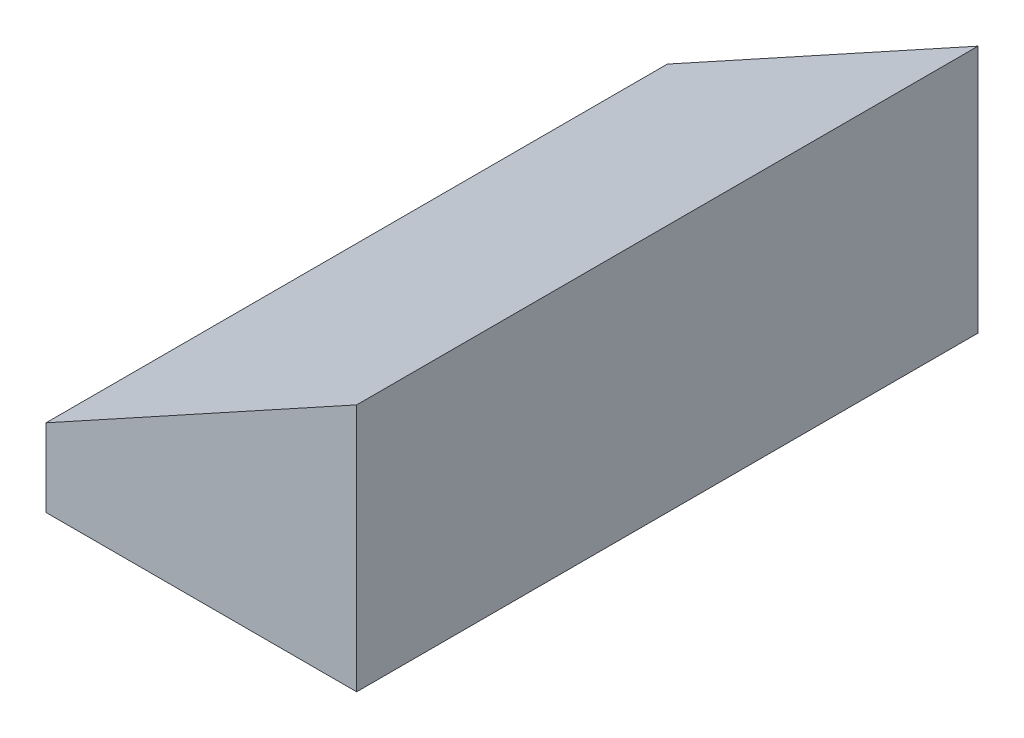
ISO-10303-21;
HEADER;
FILE_DESCRIPTION(('STEP AP214'),'2;1');
FILE_NAME('part.step','',(''),(''),'','','');
FILE_SCHEMA(('AUTOMOTIVE_DESIGN { 1 0 10303 214 1 1 1 1 }'));
ENDSEC;
DATA;
#1=APPLICATION_CONTEXT('core data for automotive mechanical design processes');
#2=APPLICATION_PROTOCOL_DEFINITION('international standard','automotive_design',2000,#1);
#3=PRODUCT_CONTEXT('',#1,'mechanical');
#4=PRODUCT('Part','Part','',(#3));
#5=PRODUCT_RELATED_PRODUCT_CATEGORY('part','',(#4));
#6=PRODUCT_DEFINITION_FORMATION('','',#4);
#7=PRODUCT_DEFINITION_CONTEXT('part definition',#1,'design');
#8=PRODUCT_DEFINITION('design','',#6,#7);
#9=PRODUCT_DEFINITION_SHAPE('','',#8);
#10=(LENGTH_UNIT() NAMED_UNIT(*) SI_UNIT(.MILLI.,.METRE.));
#11=(NAMED_UNIT(*) PLANE_ANGLE_UNIT() SI_UNIT($,.RADIAN.));
#12=(NAMED_UNIT(*) SI_UNIT($,.STERADIAN.) SOLID_ANGLE_UNIT());
#13=UNCERTAINTY_MEASURE_WITH_UNIT(LENGTH_MEASURE(1.E-05),#10,'distance_accuracy_value','');
#14=(GEOMETRIC_REPRESENTATION_CONTEXT(3) GLOBAL_UNCERTAINTY_ASSIGNED_CONTEXT((#13)) GLOBAL_UNIT_ASSIGNED_CONTEXT((#10,
#11,#12)) REPRESENTATION_CONTEXT('',''));
#15=CARTESIAN_POINT('',(0.,0.,0.));
#16=DIRECTION('',(0.,0.,1.));
#17=DIRECTION('',(1.,0.,0.));
#18=AXIS2_PLACEMENT_3D('',#15,#16,#17);
#19=CARTESIAN_POINT('',(8.,0.,16.));
#20=DIRECTION('',(0.,1.,0.));
#21=DIRECTION('',(-1.,0.,0.));
#22=AXIS2_PLACEMENT_3D('',#19,#20,#21);
#23=PLANE('',#22);
#24=DIRECTION('',(1.,0.,0.));
#25=VECTOR('',#24,1.);
#26=CARTESIAN_POINT('',(1.6,0.,1.6));
#27=LINE('',#26,#25);
#28=CARTESIAN_POINT('',(1.6,0.,1.6));
#29=VERTEX_POINT('',#28);
#30=CARTESIAN_POINT('',(6.4,0.,1.6));
#31=VERTEX_POINT('',#30);
#32=EDGE_CURVE('E151',#29,#31,#27,.T.);
#33=ORIENTED_EDGE('',*,*,#32,.F.);
#34=DIRECTION('',(0.,0.,-1.));
#35=VECTOR('',#34,1.);
#36=CARTESIAN_POINT('',(1.6,0.,14.4));
#37=LINE('',#36,#35);
#38=CARTESIAN_POINT('',(1.6,0.,14.4));
#39=VERTEX_POINT('',#38);
#40=EDGE_CURVE('E147',#39,#29,#37,.T.);
#41=ORIENTED_EDGE('',*,*,#40,.F.);
#42=DIRECTION('',(-1.,0.,0.));
#43=VECTOR('',#42,1.);
#44=CARTESIAN_POINT('',(1.6,0.,14.4));
#45=LINE('',#44,#43);
#46=CARTESIAN_POINT('',(6.4,0.,14.4));
#47=VERTEX_POINT('',#46);
#48=EDGE_CURVE('E162',#47,#39,#45,.T.);
#49=ORIENTED_EDGE('',*,*,#48,.F.);
#50=DIRECTION('',(0.,0.,1.));
#51=VECTOR('',#50,1.);
#52=CARTESIAN_POINT('',(6.4,0.,14.4));
#53=LINE('',#52,#51);
#54=EDGE_CURVE('E173',#31,#47,#53,.T.);
#55=ORIENTED_EDGE('',*,*,#54,.F.);
#56=EDGE_LOOP('',(#33,#41,#49,#55));
#57=FACE_BOUND('',#56,.T.);
#58=DIRECTION('',(1.,0.,0.));
#59=VECTOR('',#58,1.);
#60=CARTESIAN_POINT('',(8.,0.,0.));
#61=LINE('',#60,#59);
#62=CARTESIAN_POINT('',(0.,0.,0.));
#63=VERTEX_POINT('',#62);
#64=CARTESIAN_POINT('',(8.,0.,0.));
#65=VERTEX_POINT('',#64);
#66=EDGE_CURVE('E183',#63,#65,#61,.T.);
#67=ORIENTED_EDGE('',*,*,#66,.T.);
#68=DIRECTION('',(0.,0.,-1.));
#69=VECTOR('',#68,1.);
#70=CARTESIAN_POINT('',(8.,0.,16.));
#71=LINE('',#70,#69);
#72=CARTESIAN_POINT('',(8.,0.,16.));
#73=VERTEX_POINT('',#72);
#74=EDGE_CURVE('E128',#73,#65,#71,.T.);
#75=ORIENTED_EDGE('',*,*,#74,.F.);
#76=DIRECTION('',(1.,0.,0.));
#77=VECTOR('',#76,1.);
#78=CARTESIAN_POINT('',(8.,0.,16.));
#79=LINE('',#78,#77);
#80=CARTESIAN_POINT('',(0.,0.,16.));
#81=VERTEX_POINT('',#80);
#82=EDGE_CURVE('E193',#81,#73,#79,.T.);
#83=ORIENTED_EDGE('',*,*,#82,.F.);
#84=DIRECTION('',(0.,0.,-1.));
#85=VECTOR('',#84,1.);
#86=CARTESIAN_POINT('',(0.,0.,16.));
#87=LINE('',#86,#85);
#88=EDGE_CURVE('E207',#81,#63,#87,.T.);
#89=ORIENTED_EDGE('',*,*,#88,.T.);
#90=EDGE_LOOP('',(#67,#75,#83,#89));
#91=FACE_BOUND('',#90,.T.);
#92=ADVANCED_FACE('F42',(#57,#91),#23,.F.);
#93=CARTESIAN_POINT('',(8.,6.4,16.));
#94=DIRECTION('',(-1.,0.,0.));
#95=DIRECTION('',(0.,-1.,0.));
#96=AXIS2_PLACEMENT_3D('',#93,#94,#95);
#97=PLANE('',#96);
#98=DIRECTION('',(0.,1.,0.));
#99=VECTOR('',#98,1.);
#100=CARTESIAN_POINT('',(8.,6.4,0.));
#101=LINE('',#100,#99);
#102=CARTESIAN_POINT('',(8.,6.4,0.));
#103=VERTEX_POINT('',#102);
#104=EDGE_CURVE('E211',#65,#103,#101,.T.);
#105=ORIENTED_EDGE('',*,*,#104,.T.);
#106=DIRECTION('',(0.,0.,-1.));
#107=VECTOR('',#106,1.);
#108=CARTESIAN_POINT('',(8.,6.4,16.));
#109=LINE('',#108,#107);
#110=CARTESIAN_POINT('',(8.,6.4,16.));
#111=VERTEX_POINT('',#110);
#112=EDGE_CURVE('E226',#111,#103,#109,.T.);
#113=ORIENTED_EDGE('',*,*,#112,.F.);
#114=DIRECTION('',(0.,1.,0.));
#115=VECTOR('',#114,1.);
#116=CARTESIAN_POINT('',(8.,6.4,16.));
#117=LINE('',#116,#115);
#118=EDGE_CURVE('E197',#73,#111,#117,.T.);
#119=ORIENTED_EDGE('',*,*,#118,.F.);
#120=ORIENTED_EDGE('',*,*,#74,.T.);
#121=EDGE_LOOP('',(#105,#113,#119,#120));
#122=FACE_BOUND('',#121,.T.);
#123=ADVANCED_FACE('F234',(#122),#97,.F.);
#124=CARTESIAN_POINT('',(0.,2.,16.));
#125=DIRECTION('',(0.481918749772156,-0.876215908676647,0.));
#126=DIRECTION('',(0.876215908676647,0.481918749772156,0.));
#127=AXIS2_PLACEMENT_3D('',#124,#125,#126);
#128=PLANE('',#127);
#129=DIRECTION('',(-0.876215908676647,-0.481918749772156,0.));
#130=VECTOR('',#129,1.);
#131=CARTESIAN_POINT('',(0.,2.,0.));
#132=LINE('',#131,#130);
#133=CARTESIAN_POINT('',(0.,2.,0.));
#134=VERTEX_POINT('',#133);
#135=EDGE_CURVE('E214',#103,#134,#132,.T.);
#136=ORIENTED_EDGE('',*,*,#135,.T.);
#137=DIRECTION('',(0.,0.,-1.));
#138=VECTOR('',#137,1.);
#139=CARTESIAN_POINT('',(0.,2.,16.));
#140=LINE('',#139,#138);
#141=CARTESIAN_POINT('',(0.,2.,16.));
#142=VERTEX_POINT('',#141);
#143=EDGE_CURVE('E222',#142,#134,#140,.T.);
#144=ORIENTED_EDGE('',*,*,#143,.F.);
#145=DIRECTION('',(-0.876215908676647,-0.481918749772156,0.));
#146=VECTOR('',#145,1.);
#147=CARTESIAN_POINT('',(0.,2.,16.));
#148=LINE('',#147,#146);
#149=EDGE_CURVE('E201',#111,#142,#148,.T.);
#150=ORIENTED_EDGE('',*,*,#149,.F.);
#151=ORIENTED_EDGE('',*,*,#112,.T.);
#152=EDGE_LOOP('',(#136,#144,#150,#151));
#153=FACE_BOUND('',#152,.T.);
#154=ADVANCED_FACE('F246',(#153),#128,.F.);
#155=CARTESIAN_POINT('',(0.,0.,16.));
#156=DIRECTION('',(1.,0.,0.));
#157=DIRECTION('',(0.,0.,-1.));
#158=AXIS2_PLACEMENT_3D('',#155,#156,#157);
#159=PLANE('',#158);
#160=DIRECTION('',(0.,-1.,0.));
#161=VECTOR('',#160,1.);
#162=CARTESIAN_POINT('',(0.,0.,0.));
#163=LINE('',#162,#161);
#164=EDGE_CURVE('E198',#134,#63,#163,.T.);
#165=ORIENTED_EDGE('',*,*,#164,.T.);
#166=ORIENTED_EDGE('',*,*,#88,.F.);
#167=DIRECTION('',(0.,-1.,0.));
#168=VECTOR('',#167,1.);
#169=CARTESIAN_POINT('',(0.,0.,16.));
#170=LINE('',#169,#168);
#171=EDGE_CURVE('E204',#142,#81,#170,.T.);
#172=ORIENTED_EDGE('',*,*,#171,.F.);
#173=ORIENTED_EDGE('',*,*,#143,.T.);
#174=EDGE_LOOP('',(#165,#166,#172,#173));
#175=FACE_BOUND('',#174,.T.);
#176=ADVANCED_FACE('F250',(#175),#159,.F.);
#177=CARTESIAN_POINT('',(0.,0.,16.));
#178=DIRECTION('',(0.,0.,-1.));
#179=DIRECTION('',(-1.,0.,0.));
#180=AXIS2_PLACEMENT_3D('',#177,#178,#179);
#181=PLANE('',#180);
#182=ORIENTED_EDGE('',*,*,#82,.T.);
#183=ORIENTED_EDGE('',*,*,#118,.T.);
#184=ORIENTED_EDGE('',*,*,#149,.T.);
#185=ORIENTED_EDGE('',*,*,#171,.T.);
#186=EDGE_LOOP('',(#182,#183,#184,#185));
#187=FACE_BOUND('',#186,.T.);
#188=ADVANCED_FACE('F252',(#187),#181,.F.);
#189=CARTESIAN_POINT('',(0.,0.,0.));
#190=DIRECTION('',(0.,0.,-1.));
#191=DIRECTION('',(-1.,0.,0.));
#192=AXIS2_PLACEMENT_3D('',#189,#190,#191);
#193=PLANE('',#192);
#194=ORIENTED_EDGE('',*,*,#66,.F.);
#195=ORIENTED_EDGE('',*,*,#164,.F.);
#196=ORIENTED_EDGE('',*,*,#135,.F.);
#197=ORIENTED_EDGE('',*,*,#104,.F.);
#198=EDGE_LOOP('',(#194,#195,#196,#197));
#199=FACE_BOUND('',#198,.T.);
#200=ADVANCED_FACE('F242',(#199),#193,.T.);
#201=CARTESIAN_POINT('',(1.6,1.8,14.4));
#202=DIRECTION('',(-1.,0.,0.));
#203=DIRECTION('',(0.,0.,1.));
#204=AXIS2_PLACEMENT_3D('',#201,#202,#203);
#205=PLANE('',#204);
#206=ORIENTED_EDGE('',*,*,#40,.T.);
#207=DIRECTION('',(0.,-1.,0.));
#208=VECTOR('',#207,1.);
#209=CARTESIAN_POINT('',(1.6,1.8,1.6));
#210=LINE('',#209,#208);
#211=CARTESIAN_POINT('',(1.6,1.8,1.6));
#212=VERTEX_POINT('',#211);
#213=EDGE_CURVE('E168',#212,#29,#210,.T.);
#214=ORIENTED_EDGE('',*,*,#213,.F.);
#215=DIRECTION('',(0.,0.,-1.));
#216=VECTOR('',#215,1.);
#217=CARTESIAN_POINT('',(1.6,1.8,14.4));
#218=LINE('',#217,#216);
#219=CARTESIAN_POINT('',(1.6,1.8,14.4));
#220=VERTEX_POINT('',#219);
#221=EDGE_CURVE('E157',#220,#212,#218,.T.);
#222=ORIENTED_EDGE('',*,*,#221,.F.);
#223=DIRECTION('',(0.,-1.,0.));
#224=VECTOR('',#223,1.);
#225=CARTESIAN_POINT('',(1.6,1.8,14.4));
#226=LINE('',#225,#224);
#227=EDGE_CURVE('E180',#220,#39,#226,.T.);
#228=ORIENTED_EDGE('',*,*,#227,.T.);
#229=EDGE_LOOP('',(#206,#214,#222,#228));
#230=FACE_BOUND('',#229,.T.);
#231=ADVANCED_FACE('F259',(#230),#205,.F.);
#232=CARTESIAN_POINT('',(1.6,1.8,14.4));
#233=DIRECTION('',(0.,0.,1.));
#234=DIRECTION('',(1.,0.,0.));
#235=AXIS2_PLACEMENT_3D('',#232,#233,#234);
#236=PLANE('',#235);
#237=ORIENTED_EDGE('',*,*,#48,.T.);
#238=ORIENTED_EDGE('',*,*,#227,.F.);
#239=DIRECTION('',(-1.,0.,0.));
#240=VECTOR('',#239,1.);
#241=CARTESIAN_POINT('',(1.6,1.8,14.4));
#242=LINE('',#241,#240);
#243=CARTESIAN_POINT('',(2.95642537033115,1.8,14.4));
#244=VERTEX_POINT('',#243);
#245=EDGE_CURVE('E166',#244,#220,#242,.T.);
#246=ORIENTED_EDGE('',*,*,#245,.F.);
#247=DIRECTION('',(-0.876215908676647,-0.481918749772156,0.));
#248=VECTOR('',#247,1.);
#249=CARTESIAN_POINT('',(-0.073459750844397,0.133563183353449,14.4));
#250=LINE('',#249,#248);
#251=CARTESIAN_POINT('',(6.4,3.69396604631787,14.4));
#252=VERTEX_POINT('',#251);
#253=EDGE_CURVE('E143',#252,#244,#250,.T.);
#254=ORIENTED_EDGE('',*,*,#253,.F.);
#255=DIRECTION('',(0.,-1.,0.));
#256=VECTOR('',#255,1.);
#257=CARTESIAN_POINT('',(6.4,1.8,14.4));
#258=LINE('',#257,#256);
#259=EDGE_CURVE('E184',#252,#47,#258,.T.);
#260=ORIENTED_EDGE('',*,*,#259,.T.);
#261=EDGE_LOOP('',(#237,#238,#246,#254,#260));
#262=FACE_BOUND('',#261,.T.);
#263=ADVANCED_FACE('F279',(#262),#236,.F.);
#264=CARTESIAN_POINT('',(6.4,1.8,14.4));
#265=DIRECTION('',(1.,0.,0.));
#266=DIRECTION('',(0.,0.,-1.));
#267=AXIS2_PLACEMENT_3D('',#264,#265,#266);
#268=PLANE('',#267);
#269=ORIENTED_EDGE('',*,*,#54,.T.);
#270=ORIENTED_EDGE('',*,*,#259,.F.);
#271=DIRECTION('',(0.,0.,-1.));
#272=VECTOR('',#271,1.);
#273=CARTESIAN_POINT('',(6.4,3.69396604631787,16.));
#274=LINE('',#273,#272);
#275=CARTESIAN_POINT('',(6.4,3.69396604631787,1.6));
#276=VERTEX_POINT('',#275);
#277=EDGE_CURVE('E153',#252,#276,#274,.T.);
#278=ORIENTED_EDGE('',*,*,#277,.T.);
#279=DIRECTION('',(0.,-1.,0.));
#280=VECTOR('',#279,1.);
#281=CARTESIAN_POINT('',(6.4,1.8,1.6));
#282=LINE('',#281,#280);
#283=EDGE_CURVE('E187',#276,#31,#282,.T.);
#284=ORIENTED_EDGE('',*,*,#283,.T.);
#285=EDGE_LOOP('',(#269,#270,#278,#284));
#286=FACE_BOUND('',#285,.T.);
#287=ADVANCED_FACE('F282',(#286),#268,.F.);
#288=CARTESIAN_POINT('',(1.6,1.8,1.6));
#289=DIRECTION('',(0.,0.,-1.));
#290=DIRECTION('',(-1.,0.,0.));
#291=AXIS2_PLACEMENT_3D('',#288,#289,#290);
#292=PLANE('',#291);
#293=ORIENTED_EDGE('',*,*,#32,.T.);
#294=ORIENTED_EDGE('',*,*,#283,.F.);
#295=DIRECTION('',(-0.876215908676647,-0.481918749772156,0.));
#296=VECTOR('',#295,1.);
#297=CARTESIAN_POINT('',(-0.073459750844397,0.133563183353449,1.6));
#298=LINE('',#297,#296);
#299=CARTESIAN_POINT('',(2.95642537033115,1.8,1.6));
#300=VERTEX_POINT('',#299);
#301=EDGE_CURVE('E286',#276,#300,#298,.T.);
#302=ORIENTED_EDGE('',*,*,#301,.T.);
#303=DIRECTION('',(1.,0.,0.));
#304=VECTOR('',#303,1.);
#305=CARTESIAN_POINT('',(1.6,1.8,1.6));
#306=LINE('',#305,#304);
#307=EDGE_CURVE('E161',#212,#300,#306,.T.);
#308=ORIENTED_EDGE('',*,*,#307,.F.);
#309=ORIENTED_EDGE('',*,*,#213,.T.);
#310=EDGE_LOOP('',(#293,#294,#302,#308,#309));
#311=FACE_BOUND('',#310,.T.);
#312=ADVANCED_FACE('F273',(#311),#292,.F.);
#313=CARTESIAN_POINT('',(0.,1.8,0.));
#314=DIRECTION('',(0.,-1.,0.));
#315=DIRECTION('',(1.,0.,0.));
#316=AXIS2_PLACEMENT_3D('',#313,#314,#315);
#317=PLANE('',#316);
#318=CARTESIAN_POINT('',(4.,1.8,8.));
#319=DIRECTION('',(0.,-1.,0.));
#320=DIRECTION('',(1.,0.,0.));
#321=AXIS2_PLACEMENT_3D('',#318,#319,#320);
#322=CIRCLE('',#321,1.6);
#323=CARTESIAN_POINT('',(2.95642537033115,1.8,9.21282809676867));
#324=VERTEX_POINT('',#323);
#325=CARTESIAN_POINT('',(2.95642537033115,1.8,6.78717190323133));
#326=VERTEX_POINT('',#325);
#327=EDGE_CURVE('E134',#324,#326,#322,.T.);
#328=ORIENTED_EDGE('',*,*,#327,.F.);
#329=DIRECTION('',(0.,0.,-1.));
#330=VECTOR('',#329,1.);
#331=CARTESIAN_POINT('',(2.95642537033115,1.8,16.));
#332=LINE('',#331,#330);
#333=EDGE_CURVE('E140',#244,#324,#332,.T.);
#334=ORIENTED_EDGE('',*,*,#333,.F.);
#335=ORIENTED_EDGE('',*,*,#245,.T.);
#336=ORIENTED_EDGE('',*,*,#221,.T.);
#337=ORIENTED_EDGE('',*,*,#307,.T.);
#338=EDGE_CURVE('E64',#326,#300,#332,.T.);
#339=ORIENTED_EDGE('',*,*,#338,.F.);
#340=EDGE_LOOP('',(#328,#334,#335,#336,#337,#339));
#341=FACE_BOUND('',#340,.T.);
#342=ADVANCED_FACE('F292',(#341),#317,.T.);
#343=CARTESIAN_POINT('',(0.77106999963545,0.598054546117365,16.));
#344=DIRECTION('',(0.481918749772156,-0.876215908676647,0.));
#345=DIRECTION('',(0.876215908676647,0.481918749772156,0.));
#346=AXIS2_PLACEMENT_3D('',#343,#344,#345);
#347=PLANE('',#346);
#348=CARTESIAN_POINT('',(4.,2.37396604631787,8.));
#349=DIRECTION('',(0.481918749772156,-0.876215908676647,0.));
#350=DIRECTION('',(-0.876215908676647,-0.481918749772156,0.));
#351=AXIS2_PLACEMENT_3D('',#348,#349,#350);
#352=ELLIPSE('',#351,1.82603395368213,1.6);
#353=CARTESIAN_POINT('',(5.13824355214933,3.,9.12445614231524));
#354=VERTEX_POINT('',#353);
#355=EDGE_CURVE('E11',#354,#324,#352,.T.);
#356=ORIENTED_EDGE('',*,*,#355,.F.);
#357=DIRECTION('',(0.,0.,-1.));
#358=VECTOR('',#357,1.);
#359=CARTESIAN_POINT('',(5.13824355214933,3.,16.));
#360=LINE('',#359,#358);
#361=CARTESIAN_POINT('',(5.13824355214933,3.,6.87554385768476));
#362=VERTEX_POINT('',#361);
#363=EDGE_CURVE('E124',#354,#362,#360,.T.);
#364=ORIENTED_EDGE('',*,*,#363,.T.);
#365=EDGE_CURVE('E45',#326,#362,#352,.T.);
#366=ORIENTED_EDGE('',*,*,#365,.F.);
#367=ORIENTED_EDGE('',*,*,#338,.T.);
#368=ORIENTED_EDGE('',*,*,#301,.F.);
#369=ORIENTED_EDGE('',*,*,#277,.F.);
#370=ORIENTED_EDGE('',*,*,#253,.T.);
#371=ORIENTED_EDGE('',*,*,#333,.T.);
#372=EDGE_LOOP('',(#356,#364,#366,#367,#368,#369,#370,#371));
#373=FACE_BOUND('',#372,.T.);
#374=ADVANCED_FACE('F138',(#373),#347,.T.);
#375=CARTESIAN_POINT('',(4.,3.,8.));
#376=DIRECTION('',(0.,-1.,0.));
#377=DIRECTION('',(1.,0.,0.));
#378=AXIS2_PLACEMENT_3D('',#375,#376,#377);
#379=CYLINDRICAL_SURFACE('',#378,1.6);
#380=CARTESIAN_POINT('',(4.,3.,8.));
#381=DIRECTION('',(0.,-1.,0.));
#382=DIRECTION('',(1.,0.,0.));
#383=AXIS2_PLACEMENT_3D('',#380,#381,#382);
#384=CIRCLE('',#383,1.6);
#385=EDGE_CURVE('E56',#362,#354,#384,.T.);
#386=ORIENTED_EDGE('',*,*,#385,.T.);
#387=ORIENTED_EDGE('',*,*,#355,.T.);
#388=ORIENTED_EDGE('',*,*,#327,.T.);
#389=ORIENTED_EDGE('',*,*,#365,.T.);
#390=EDGE_LOOP('',(#386,#387,#388,#389));
#391=FACE_BOUND('',#390,.T.);
#392=CARTESIAN_POINT('',(4.,0.,8.));
#393=DIRECTION('',(0.,-1.,0.));
#394=DIRECTION('',(1.,0.,0.));
#395=AXIS2_PLACEMENT_3D('',#392,#393,#394);
#396=CIRCLE('',#395,1.6);
#397=CARTESIAN_POINT('',(5.6,0.,8.));
#398=VERTEX_POINT('',#397);
#399=EDGE_CURVE('E135',#398,#398,#396,.T.);
#400=ORIENTED_EDGE('',*,*,#399,.F.);
#401=EDGE_LOOP('',(#400));
#402=FACE_BOUND('',#401,.T.);
#403=ADVANCED_FACE('F130',(#391,#402),#379,.T.);
#404=CARTESIAN_POINT('',(4.,3.,8.));
#405=DIRECTION('',(0.,-1.,0.));
#406=DIRECTION('',(1.,0.,0.));
#407=AXIS2_PLACEMENT_3D('',#404,#405,#406);
#408=PLANE('',#407);
#409=ORIENTED_EDGE('',*,*,#363,.F.);
#410=ORIENTED_EDGE('',*,*,#385,.F.);
#411=EDGE_LOOP('',(#409,#410));
#412=FACE_BOUND('',#411,.T.);
#413=ADVANCED_FACE('F125',(#412),#408,.F.);
#414=CARTESIAN_POINT('',(4.,0.,8.));
#415=DIRECTION('',(0.,-1.,0.));
#416=DIRECTION('',(1.,0.,0.));
#417=AXIS2_PLACEMENT_3D('',#414,#415,#416);
#418=PLANE('',#417);
#419=CARTESIAN_POINT('',(4.,0.,8.));
#420=DIRECTION('',(0.,-1.,0.));
#421=DIRECTION('',(1.,0.,0.));
#422=AXIS2_PLACEMENT_3D('',#419,#420,#421);
#423=CIRCLE('',#422,0.800000000000001);
#424=CARTESIAN_POINT('',(4.8,0.,8.));
#425=VERTEX_POINT('',#424);
#426=EDGE_CURVE('E467',#425,#425,#423,.T.);
#427=ORIENTED_EDGE('',*,*,#426,.F.);
#428=EDGE_LOOP('',(#427));
#429=FACE_BOUND('',#428,.T.);
#430=ORIENTED_EDGE('',*,*,#399,.T.);
#431=EDGE_LOOP('',(#430));
#432=FACE_BOUND('',#431,.T.);
#433=ADVANCED_FACE('F354',(#429,#432),#418,.T.);
#434=CARTESIAN_POINT('',(4.,3.,8.));
#435=DIRECTION('',(0.,-1.,0.));
#436=DIRECTION('',(1.,0.,0.));
#437=AXIS2_PLACEMENT_3D('',#434,#435,#436);
#438=CYLINDRICAL_SURFACE('',#437,0.800000000000001);
#439=CARTESIAN_POINT('',(4.,3.,8.));
#440=DIRECTION('',(0.,-1.,0.));
#441=DIRECTION('',(1.,0.,0.));
#442=AXIS2_PLACEMENT_3D('',#439,#440,#441);
#443=CIRCLE('',#442,0.800000000000001);
#444=CARTESIAN_POINT('',(4.8,3.,8.));
#445=VERTEX_POINT('',#444);
#446=EDGE_CURVE('E465',#445,#445,#443,.T.);
#447=ORIENTED_EDGE('',*,*,#446,.F.);
#448=EDGE_LOOP('',(#447));
#449=FACE_BOUND('',#448,.T.);
#450=ORIENTED_EDGE('',*,*,#426,.T.);
#451=EDGE_LOOP('',(#450));
#452=FACE_BOUND('',#451,.T.);
#453=ADVANCED_FACE('F364',(#449,#452),#438,.F.);
#454=CARTESIAN_POINT('',(4.,3.,8.));
#455=DIRECTION('',(0.,-1.,0.));
#456=DIRECTION('',(1.,0.,0.));
#457=AXIS2_PLACEMENT_3D('',#454,#455,#456);
#458=PLANE('',#457);
#459=ORIENTED_EDGE('',*,*,#446,.T.);
#460=EDGE_LOOP('',(#459));
#461=FACE_BOUND('',#460,.T.);
#462=ADVANCED_FACE('F375',(#461),#458,.T.);
#463=CLOSED_SHELL('',(#92,#123,#154,#176,#188,#200,#231,#263,#287,#312,#342,#374,#403,#413,#433,
#453,#462));
#464=MANIFOLD_SOLID_BREP('B2',#463);
#465=ADVANCED_BREP_SHAPE_REPRESENTATION('',(#18,#464),#14);
#466=SHAPE_DEFINITION_REPRESENTATION(#9,#465);
ENDSEC;
END-ISO-10303-21;
